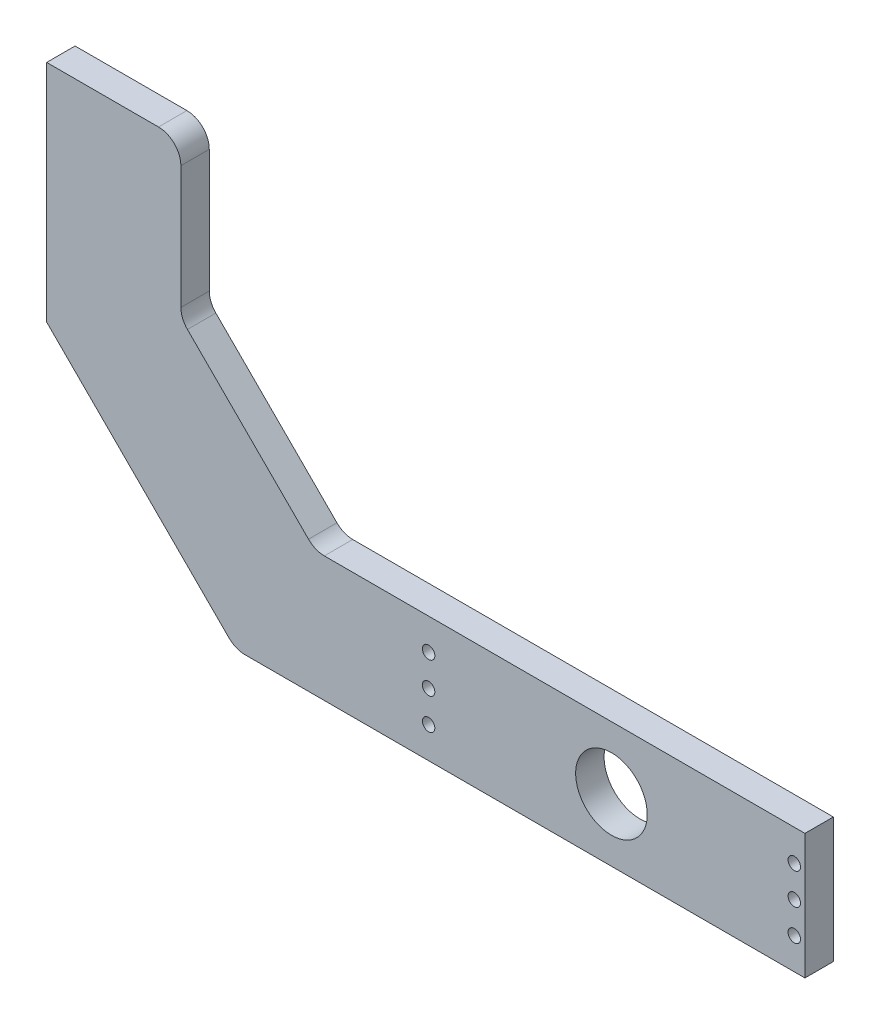
ISO-10303-21;
HEADER;
FILE_DESCRIPTION(('STEP AP214'),'2;1');
FILE_NAME('part.step','',(''),(''),'','','');
FILE_SCHEMA(('AUTOMOTIVE_DESIGN { 1 0 10303 214 1 1 1 1 }'));
ENDSEC;
DATA;
#1=APPLICATION_CONTEXT('core data for automotive mechanical design processes');
#2=APPLICATION_PROTOCOL_DEFINITION('international standard','automotive_design',2000,#1);
#3=PRODUCT_CONTEXT('',#1,'mechanical');
#4=PRODUCT('Part','Part','',(#3));
#5=PRODUCT_RELATED_PRODUCT_CATEGORY('part','',(#4));
#6=PRODUCT_DEFINITION_FORMATION('','',#4);
#7=PRODUCT_DEFINITION_CONTEXT('part definition',#1,'design');
#8=PRODUCT_DEFINITION('design','',#6,#7);
#9=PRODUCT_DEFINITION_SHAPE('','',#8);
#10=(LENGTH_UNIT() NAMED_UNIT(*) SI_UNIT(.MILLI.,.METRE.));
#11=(NAMED_UNIT(*) PLANE_ANGLE_UNIT() SI_UNIT($,.RADIAN.));
#12=(NAMED_UNIT(*) SI_UNIT($,.STERADIAN.) SOLID_ANGLE_UNIT());
#13=UNCERTAINTY_MEASURE_WITH_UNIT(LENGTH_MEASURE(1.E-05),#10,'distance_accuracy_value','');
#14=(GEOMETRIC_REPRESENTATION_CONTEXT(3) GLOBAL_UNCERTAINTY_ASSIGNED_CONTEXT((#13)) GLOBAL_UNIT_ASSIGNED_CONTEXT((#10,
#11,#12)) REPRESENTATION_CONTEXT('',''));
#15=CARTESIAN_POINT('',(0.,0.,0.));
#16=DIRECTION('',(0.,0.,1.));
#17=DIRECTION('',(1.,0.,0.));
#18=AXIS2_PLACEMENT_3D('',#15,#16,#17);
#19=CARTESIAN_POINT('',(18.4222454265078,-36.0239718131345,12.7));
#20=DIRECTION('',(0.,-1.,0.));
#21=DIRECTION('',(1.,0.,0.));
#22=AXIS2_PLACEMENT_3D('',#19,#20,#21);
#23=PLANE('',#22);
#24=DIRECTION('',(-1.,0.,0.));
#25=VECTOR('',#24,1.);
#26=CARTESIAN_POINT('',(18.4222454265078,-36.0239718131345,0.));
#27=LINE('',#26,#25);
#28=CARTESIAN_POINT('',(224.714042280299,-36.0239718131342,0.));
#29=VERTEX_POINT('',#28);
#30=CARTESIAN_POINT('',(9.85617790402953,-36.0239718131345,0.));
#31=VERTEX_POINT('',#30);
#32=EDGE_CURVE('E163',#29,#31,#27,.T.);
#33=ORIENTED_EDGE('',*,*,#32,.T.);
#34=DIRECTION('',(0.,0.,-1.));
#35=VECTOR('',#34,1.);
#36=CARTESIAN_POINT('',(9.85617790402953,-36.0239718131345,12.7));
#37=LINE('',#36,#35);
#38=CARTESIAN_POINT('',(9.85617790402953,-36.0239718131345,12.7));
#39=VERTEX_POINT('',#38);
#40=EDGE_CURVE('E198',#31,#39,#37,.F.);
#41=ORIENTED_EDGE('',*,*,#40,.T.);
#42=DIRECTION('',(-1.,0.,0.));
#43=VECTOR('',#42,1.);
#44=CARTESIAN_POINT('',(18.4222454265078,-36.0239718131345,12.7));
#45=LINE('',#44,#43);
#46=CARTESIAN_POINT('',(224.714042280299,-36.0239718131342,12.7));
#47=VERTEX_POINT('',#46);
#48=EDGE_CURVE('E180',#47,#39,#45,.T.);
#49=ORIENTED_EDGE('',*,*,#48,.F.);
#50=DIRECTION('',(0.,0.,-1.));
#51=VECTOR('',#50,1.);
#52=CARTESIAN_POINT('',(224.714042280299,-36.0239718131342,12.7));
#53=LINE('',#52,#51);
#54=EDGE_CURVE('E162',#47,#29,#53,.T.);
#55=ORIENTED_EDGE('',*,*,#54,.T.);
#56=EDGE_LOOP('',(#33,#41,#49,#55));
#57=FACE_BOUND('',#56,.T.);
#58=ADVANCED_FACE('F36',(#57),#23,.F.);
#59=CARTESIAN_POINT('',(201.815385528004,-232.125315060842,12.7));
#60=DIRECTION('',(-0.707106781186551,-0.707106781186544,0.));
#61=DIRECTION('',(0.707106781186544,-0.707106781186551,0.));
#62=AXIS2_PLACEMENT_3D('',#59,#60,#61);
#63=PLANE('',#62);
#64=DIRECTION('',(-0.707106781186544,0.707106781186551,0.));
#65=VECTOR('',#64,1.);
#66=CARTESIAN_POINT('',(201.815385528004,-232.125315060842,0.));
#67=LINE('',#66,#65);
#68=CARTESIAN_POINT('',(2.78511009216395,-33.0950396249999,0.));
#69=VERTEX_POINT('',#68);
#70=CARTESIAN_POINT('',(-51.3570255315668,21.0470959987314,0.));
#71=VERTEX_POINT('',#70);
#72=EDGE_CURVE('E166',#69,#71,#67,.T.);
#73=ORIENTED_EDGE('',*,*,#72,.T.);
#74=DIRECTION('',(0.,0.,-1.));
#75=VECTOR('',#74,1.);
#76=CARTESIAN_POINT('',(-51.3570255315668,21.0470959987314,12.7));
#77=LINE('',#76,#75);
#78=CARTESIAN_POINT('',(-51.3570255315668,21.0470959987314,12.7));
#79=VERTEX_POINT('',#78);
#80=EDGE_CURVE('E196',#71,#79,#77,.F.);
#81=ORIENTED_EDGE('',*,*,#80,.T.);
#82=DIRECTION('',(-0.707106781186544,0.707106781186551,0.));
#83=VECTOR('',#82,1.);
#84=CARTESIAN_POINT('',(201.815385528004,-232.125315060842,12.7));
#85=LINE('',#84,#83);
#86=CARTESIAN_POINT('',(2.78511009216395,-33.0950396249999,12.7));
#87=VERTEX_POINT('',#86);
#88=EDGE_CURVE('E230',#87,#79,#85,.T.);
#89=ORIENTED_EDGE('',*,*,#88,.F.);
#90=DIRECTION('',(0.,0.,-1.));
#91=VECTOR('',#90,1.);
#92=CARTESIAN_POINT('',(2.78511009216401,-33.0950396249999,0.));
#93=LINE('',#92,#91);
#94=EDGE_CURVE('E193',#87,#69,#93,.T.);
#95=ORIENTED_EDGE('',*,*,#94,.T.);
#96=EDGE_LOOP('',(#73,#81,#89,#95));
#97=FACE_BOUND('',#96,.T.);
#98=ADVANCED_FACE('F233',(#97),#63,.F.);
#99=CARTESIAN_POINT('',(-54.2859577197013,-415.518455162336,12.7));
#100=DIRECTION('',(1.,0.,0.));
#101=DIRECTION('',(0.,1.,0.));
#102=AXIS2_PLACEMENT_3D('',#99,#100,#101);
#103=PLANE('',#102);
#104=DIRECTION('',(0.,-1.,0.));
#105=VECTOR('',#104,1.);
#106=CARTESIAN_POINT('',(-54.2859577197013,-415.518455162336,12.7));
#107=LINE('',#106,#105);
#108=CARTESIAN_POINT('',(-54.2859577197012,82.9760281868659,12.7));
#109=VERTEX_POINT('',#108);
#110=CARTESIAN_POINT('',(-54.2859577197012,28.1181638105968,12.7));
#111=VERTEX_POINT('',#110);
#112=EDGE_CURVE('E157',#109,#111,#107,.T.);
#113=ORIENTED_EDGE('',*,*,#112,.T.);
#114=DIRECTION('',(0.,0.,-1.));
#115=VECTOR('',#114,1.);
#116=CARTESIAN_POINT('',(-54.2859577197012,28.1181638105968,12.7));
#117=LINE('',#116,#115);
#118=CARTESIAN_POINT('',(-54.2859577197012,28.1181638105968,0.));
#119=VERTEX_POINT('',#118);
#120=EDGE_CURVE('E190',#111,#119,#117,.T.);
#121=ORIENTED_EDGE('',*,*,#120,.T.);
#122=DIRECTION('',(0.,-1.,0.));
#123=VECTOR('',#122,1.);
#124=CARTESIAN_POINT('',(-54.2859577197013,-415.518455162336,0.));
#125=LINE('',#124,#123);
#126=CARTESIAN_POINT('',(-54.2859577197012,82.9760281868659,0.));
#127=VERTEX_POINT('',#126);
#128=EDGE_CURVE('E170',#127,#119,#125,.T.);
#129=ORIENTED_EDGE('',*,*,#128,.F.);
#130=DIRECTION('',(0.,0.,-1.));
#131=VECTOR('',#130,1.);
#132=CARTESIAN_POINT('',(-54.2859577197012,82.9760281868659,12.7));
#133=LINE('',#132,#131);
#134=EDGE_CURVE('E188',#127,#109,#133,.F.);
#135=ORIENTED_EDGE('',*,*,#134,.T.);
#136=EDGE_LOOP('',(#113,#121,#129,#135));
#137=FACE_BOUND('',#136,.T.);
#138=ADVANCED_FACE('F345',(#137),#103,.T.);
#139=CARTESIAN_POINT('',(18.4222454265079,92.976028186866,12.7));
#140=DIRECTION('',(0.,-1.,0.));
#141=DIRECTION('',(1.,0.,0.));
#142=AXIS2_PLACEMENT_3D('',#139,#140,#141);
#143=PLANE('',#142);
#144=DIRECTION('',(-1.,0.,0.));
#145=VECTOR('',#144,1.);
#146=CARTESIAN_POINT('',(18.4222454265079,92.976028186866,12.7));
#147=LINE('',#146,#145);
#148=CARTESIAN_POINT('',(-64.2859577197012,92.9760281868659,12.7));
#149=VERTEX_POINT('',#148);
#150=CARTESIAN_POINT('',(-114.285957719701,92.9760281868659,12.7));
#151=VERTEX_POINT('',#150);
#152=EDGE_CURVE('E151',#149,#151,#147,.T.);
#153=ORIENTED_EDGE('',*,*,#152,.F.);
#154=DIRECTION('',(0.,0.,-1.));
#155=VECTOR('',#154,1.);
#156=CARTESIAN_POINT('',(-64.2859577197012,92.9760281868659,0.));
#157=LINE('',#156,#155);
#158=CARTESIAN_POINT('',(-64.2859577197012,92.9760281868659,0.));
#159=VERTEX_POINT('',#158);
#160=EDGE_CURVE('E209',#149,#159,#157,.T.);
#161=ORIENTED_EDGE('',*,*,#160,.T.);
#162=DIRECTION('',(-1.,0.,0.));
#163=VECTOR('',#162,1.);
#164=CARTESIAN_POINT('',(18.4222454265079,92.976028186866,0.));
#165=LINE('',#164,#163);
#166=CARTESIAN_POINT('',(-114.285957719701,92.9760281868659,0.));
#167=VERTEX_POINT('',#166);
#168=EDGE_CURVE('E173',#159,#167,#165,.T.);
#169=ORIENTED_EDGE('',*,*,#168,.T.);
#170=DIRECTION('',(0.,0.,-1.));
#171=VECTOR('',#170,1.);
#172=CARTESIAN_POINT('',(-114.285957719701,92.9760281868659,12.7));
#173=LINE('',#172,#171);
#174=EDGE_CURVE('E186',#151,#167,#173,.T.);
#175=ORIENTED_EDGE('',*,*,#174,.F.);
#176=EDGE_LOOP('',(#153,#161,#169,#175));
#177=FACE_BOUND('',#176,.T.);
#178=ADVANCED_FACE('F374',(#177),#143,.F.);
#179=CARTESIAN_POINT('',(-114.285957719701,-415.518455162336,12.7));
#180=DIRECTION('',(1.,0.,0.));
#181=DIRECTION('',(0.,1.,0.));
#182=AXIS2_PLACEMENT_3D('',#179,#180,#181);
#183=PLANE('',#182);
#184=CARTESIAN_POINT('',(-114.285957719701,17.976028186866,7.90000000000001));
#185=DIRECTION('',(-1.,0.,0.));
#186=DIRECTION('',(0.,-1.,0.));
#187=AXIS2_PLACEMENT_3D('',#184,#185,#186);
#188=CIRCLE('',#187,2.5);
#189=CARTESIAN_POINT('',(-114.285957719701,15.476028186866,7.90000000000001));
#190=VERTEX_POINT('',#189);
#191=EDGE_CURVE('E257',#190,#190,#188,.T.);
#192=ORIENTED_EDGE('',*,*,#191,.F.);
#193=EDGE_LOOP('',(#192));
#194=FACE_BOUND('',#193,.T.);
#195=CARTESIAN_POINT('',(-114.285957719701,42.976028186866,7.90000000000001));
#196=DIRECTION('',(-1.,0.,0.));
#197=DIRECTION('',(0.,-1.,0.));
#198=AXIS2_PLACEMENT_3D('',#195,#196,#197);
#199=CIRCLE('',#198,2.5);
#200=CARTESIAN_POINT('',(-114.285957719701,40.476028186866,7.90000000000001));
#201=VERTEX_POINT('',#200);
#202=EDGE_CURVE('E251',#201,#201,#199,.T.);
#203=ORIENTED_EDGE('',*,*,#202,.F.);
#204=EDGE_LOOP('',(#203));
#205=FACE_BOUND('',#204,.T.);
#206=CARTESIAN_POINT('',(-114.285957719701,67.9760281868659,7.90000000000001));
#207=DIRECTION('',(-1.,0.,0.));
#208=DIRECTION('',(0.,-1.,0.));
#209=AXIS2_PLACEMENT_3D('',#206,#207,#208);
#210=CIRCLE('',#209,2.5);
#211=CARTESIAN_POINT('',(-114.285957719701,65.4760281868659,7.90000000000001));
#212=VERTEX_POINT('',#211);
#213=EDGE_CURVE('E245',#212,#212,#210,.T.);
#214=ORIENTED_EDGE('',*,*,#213,.F.);
#215=EDGE_LOOP('',(#214));
#216=FACE_BOUND('',#215,.T.);
#217=DIRECTION('',(0.,-1.,0.));
#218=VECTOR('',#217,1.);
#219=CARTESIAN_POINT('',(-114.285957719701,-415.518455162336,0.));
#220=LINE('',#219,#218);
#221=CARTESIAN_POINT('',(-114.285957719701,-7.57988285569777,0.));
#222=VERTEX_POINT('',#221);
#223=EDGE_CURVE('E145',#167,#222,#220,.T.);
#224=ORIENTED_EDGE('',*,*,#223,.T.);
#225=DIRECTION('',(0.,0.,1.));
#226=VECTOR('',#225,1.);
#227=CARTESIAN_POINT('',(-114.285957719701,-7.57988285569773,-0.000999999999999265));
#228=LINE('',#227,#226);
#229=CARTESIAN_POINT('',(-114.285957719701,-7.57988285569773,12.7));
#230=VERTEX_POINT('',#229);
#231=EDGE_CURVE('E130',#222,#230,#228,.T.);
#232=ORIENTED_EDGE('',*,*,#231,.T.);
#233=DIRECTION('',(0.,-1.,0.));
#234=VECTOR('',#233,1.);
#235=CARTESIAN_POINT('',(-114.285957719701,-415.518455162336,12.7));
#236=LINE('',#235,#234);
#237=EDGE_CURVE('E143',#151,#230,#236,.T.);
#238=ORIENTED_EDGE('',*,*,#237,.F.);
#239=ORIENTED_EDGE('',*,*,#174,.T.);
#240=EDGE_LOOP('',(#224,#232,#238,#239));
#241=FACE_BOUND('',#240,.T.);
#242=ADVANCED_FACE('F141',(#194,#205,#216,#241),#183,.F.);
#243=CARTESIAN_POINT('',(18.4222454265084,-92.0239718131342,12.7));
#244=DIRECTION('',(0.,1.,0.));
#245=DIRECTION('',(-1.,0.,0.));
#246=AXIS2_PLACEMENT_3D('',#243,#244,#245);
#247=PLANE('',#246);
#248=DIRECTION('',(1.,0.,0.));
#249=VECTOR('',#248,1.);
#250=CARTESIAN_POINT('',(18.4222454265084,-92.0239718131342,12.7));
#251=LINE('',#250,#249);
#252=CARTESIAN_POINT('',(-25.6997331385348,-92.0239718131342,12.7));
#253=VERTEX_POINT('',#252);
#254=CARTESIAN_POINT('',(224.714042280299,-92.0239718131341,12.7));
#255=VERTEX_POINT('',#254);
#256=EDGE_CURVE('E153',#253,#255,#251,.T.);
#257=ORIENTED_EDGE('',*,*,#256,.F.);
#258=DIRECTION('',(0.,0.,1.));
#259=VECTOR('',#258,1.);
#260=CARTESIAN_POINT('',(-25.6997331385348,-92.0239718131342,12.7));
#261=LINE('',#260,#259);
#262=CARTESIAN_POINT('',(-25.6997331385348,-92.0239718131342,0.));
#263=VERTEX_POINT('',#262);
#264=EDGE_CURVE('E59',#253,#263,#261,.F.);
#265=ORIENTED_EDGE('',*,*,#264,.T.);
#266=DIRECTION('',(1.,0.,0.));
#267=VECTOR('',#266,1.);
#268=CARTESIAN_POINT('',(18.4222454265084,-92.0239718131342,0.));
#269=LINE('',#268,#267);
#270=CARTESIAN_POINT('',(224.714042280299,-92.0239718131341,0.));
#271=VERTEX_POINT('',#270);
#272=EDGE_CURVE('E176',#263,#271,#269,.T.);
#273=ORIENTED_EDGE('',*,*,#272,.T.);
#274=DIRECTION('',(0.,0.,-1.));
#275=VECTOR('',#274,1.);
#276=CARTESIAN_POINT('',(224.714042280299,-92.0239718131341,12.7));
#277=LINE('',#276,#275);
#278=EDGE_CURVE('E183',#255,#271,#277,.T.);
#279=ORIENTED_EDGE('',*,*,#278,.F.);
#280=EDGE_LOOP('',(#257,#265,#273,#279));
#281=FACE_BOUND('',#280,.T.);
#282=ADVANCED_FACE('F362',(#281),#247,.F.);
#283=CARTESIAN_POINT('',(224.714042280299,-415.518455162336,12.7));
#284=DIRECTION('',(-1.,0.,0.));
#285=DIRECTION('',(0.,0.,1.));
#286=AXIS2_PLACEMENT_3D('',#283,#284,#285);
#287=PLANE('',#286);
#288=DIRECTION('',(0.,1.,0.));
#289=VECTOR('',#288,1.);
#290=CARTESIAN_POINT('',(224.714042280299,-415.518455162336,0.));
#291=LINE('',#290,#289);
#292=EDGE_CURVE('E178',#271,#29,#291,.T.);
#293=ORIENTED_EDGE('',*,*,#292,.T.);
#294=ORIENTED_EDGE('',*,*,#54,.F.);
#295=DIRECTION('',(0.,1.,0.));
#296=VECTOR('',#295,1.);
#297=CARTESIAN_POINT('',(224.714042280299,-415.518455162336,12.7));
#298=LINE('',#297,#296);
#299=EDGE_CURVE('E155',#255,#47,#298,.T.);
#300=ORIENTED_EDGE('',*,*,#299,.F.);
#301=ORIENTED_EDGE('',*,*,#278,.T.);
#302=EDGE_LOOP('',(#293,#294,#300,#301));
#303=FACE_BOUND('',#302,.T.);
#304=ADVANCED_FACE('F304',(#303),#287,.F.);
#305=CARTESIAN_POINT('',(18.4222454265084,-415.518455162336,12.7));
#306=DIRECTION('',(0.,0.,1.));
#307=DIRECTION('',(1.,0.,0.));
#308=AXIS2_PLACEMENT_3D('',#305,#306,#307);
#309=PLANE('',#308);
#310=CARTESIAN_POINT('',(219.954042280299,-50.0239718131341,12.7));
#311=DIRECTION('',(0.,0.,1.));
#312=DIRECTION('',(1.,0.,0.));
#313=AXIS2_PLACEMENT_3D('',#310,#311,#312);
#314=CIRCLE('',#313,2.78000000000001);
#315=CARTESIAN_POINT('',(222.734042280299,-50.0239718131341,12.7));
#316=VERTEX_POINT('',#315);
#317=EDGE_CURVE('E295',#316,#316,#314,.T.);
#318=ORIENTED_EDGE('',*,*,#317,.F.);
#319=EDGE_LOOP('',(#318));
#320=FACE_BOUND('',#319,.T.);
#321=CARTESIAN_POINT('',(219.954042280299,-64.0239718131341,12.7));
#322=DIRECTION('',(0.,0.,1.));
#323=DIRECTION('',(1.,0.,0.));
#324=AXIS2_PLACEMENT_3D('',#321,#322,#323);
#325=CIRCLE('',#324,2.78000000000001);
#326=CARTESIAN_POINT('',(222.734042280299,-64.0239718131341,12.7));
#327=VERTEX_POINT('',#326);
#328=EDGE_CURVE('E289',#327,#327,#325,.T.);
#329=ORIENTED_EDGE('',*,*,#328,.F.);
#330=EDGE_LOOP('',(#329));
#331=FACE_BOUND('',#330,.T.);
#332=CARTESIAN_POINT('',(219.954042280299,-78.0239718131342,12.7));
#333=DIRECTION('',(0.,0.,1.));
#334=DIRECTION('',(1.,0.,0.));
#335=AXIS2_PLACEMENT_3D('',#332,#333,#334);
#336=CIRCLE('',#335,2.78000000000001);
#337=CARTESIAN_POINT('',(222.734042280299,-78.0239718131342,12.7));
#338=VERTEX_POINT('',#337);
#339=EDGE_CURVE('E283',#338,#338,#336,.T.);
#340=ORIENTED_EDGE('',*,*,#339,.F.);
#341=EDGE_LOOP('',(#340));
#342=FACE_BOUND('',#341,.T.);
#343=CARTESIAN_POINT('',(56.4740422802987,-78.0239718131351,12.7));
#344=DIRECTION('',(0.,0.,1.));
#345=DIRECTION('',(1.,0.,0.));
#346=AXIS2_PLACEMENT_3D('',#343,#344,#345);
#347=CIRCLE('',#346,2.78000000000004);
#348=CARTESIAN_POINT('',(59.2540422802988,-78.0239718131351,12.7));
#349=VERTEX_POINT('',#348);
#350=EDGE_CURVE('E277',#349,#349,#347,.T.);
#351=ORIENTED_EDGE('',*,*,#350,.F.);
#352=EDGE_LOOP('',(#351));
#353=FACE_BOUND('',#352,.T.);
#354=CARTESIAN_POINT('',(56.4740422802987,-64.0239718131351,12.7));
#355=DIRECTION('',(0.,0.,1.));
#356=DIRECTION('',(1.,0.,0.));
#357=AXIS2_PLACEMENT_3D('',#354,#355,#356);
#358=CIRCLE('',#357,2.78000000000004);
#359=CARTESIAN_POINT('',(59.2540422802988,-64.0239718131351,12.7));
#360=VERTEX_POINT('',#359);
#361=EDGE_CURVE('E271',#360,#360,#358,.T.);
#362=ORIENTED_EDGE('',*,*,#361,.F.);
#363=EDGE_LOOP('',(#362));
#364=FACE_BOUND('',#363,.T.);
#365=CARTESIAN_POINT('',(56.4740422802987,-50.0239718131351,12.7));
#366=DIRECTION('',(0.,0.,1.));
#367=DIRECTION('',(1.,0.,0.));
#368=AXIS2_PLACEMENT_3D('',#365,#366,#367);
#369=CIRCLE('',#368,2.78);
#370=CARTESIAN_POINT('',(59.2540422802987,-50.0239718131351,12.7));
#371=VERTEX_POINT('',#370);
#372=EDGE_CURVE('E265',#371,#371,#369,.T.);
#373=ORIENTED_EDGE('',*,*,#372,.F.);
#374=EDGE_LOOP('',(#373));
#375=FACE_BOUND('',#374,.T.);
#376=DIRECTION('',(-0.707106781186544,0.707106781186551,0.));
#377=VECTOR('',#376,1.);
#378=CARTESIAN_POINT('',(-29.8418687622658,-92.0239718131342,12.7));
#379=LINE('',#378,#377);
#380=CARTESIAN_POINT('',(-32.7708009504003,-89.0950396249996,12.7));
#381=VERTEX_POINT('',#380);
#382=EDGE_CURVE('E126',#381,#230,#379,.T.);
#383=ORIENTED_EDGE('',*,*,#382,.F.);
#384=CARTESIAN_POINT('',(-25.6997331385348,-82.0239718131342,12.7));
#385=DIRECTION('',(0.,0.,1.));
#386=DIRECTION('',(1.,0.,0.));
#387=AXIS2_PLACEMENT_3D('',#384,#385,#386);
#388=CIRCLE('',#387,10.);
#389=EDGE_CURVE('E203',#381,#253,#388,.T.);
#390=ORIENTED_EDGE('',*,*,#389,.T.);
#391=ORIENTED_EDGE('',*,*,#256,.T.);
#392=ORIENTED_EDGE('',*,*,#299,.T.);
#393=ORIENTED_EDGE('',*,*,#48,.T.);
#394=CARTESIAN_POINT('',(9.85617790402951,-26.0239718131345,12.7));
#395=DIRECTION('',(0.,0.,1.));
#396=DIRECTION('',(1.,0.,0.));
#397=AXIS2_PLACEMENT_3D('',#394,#395,#396);
#398=CIRCLE('',#397,10.);
#399=EDGE_CURVE('E11',#39,#87,#398,.F.);
#400=ORIENTED_EDGE('',*,*,#399,.T.);
#401=ORIENTED_EDGE('',*,*,#88,.T.);
#402=CARTESIAN_POINT('',(-44.2859577197012,28.1181638105968,12.7));
#403=DIRECTION('',(0.,0.,1.));
#404=DIRECTION('',(1.,0.,0.));
#405=AXIS2_PLACEMENT_3D('',#402,#403,#404);
#406=CIRCLE('',#405,10.);
#407=EDGE_CURVE('E213',#79,#111,#406,.F.);
#408=ORIENTED_EDGE('',*,*,#407,.T.);
#409=ORIENTED_EDGE('',*,*,#112,.F.);
#410=CARTESIAN_POINT('',(-64.2859577197012,82.9760281868659,12.7));
#411=DIRECTION('',(0.,0.,1.));
#412=DIRECTION('',(1.,0.,0.));
#413=AXIS2_PLACEMENT_3D('',#410,#411,#412);
#414=CIRCLE('',#413,10.);
#415=EDGE_CURVE('E201',#109,#149,#414,.T.);
#416=ORIENTED_EDGE('',*,*,#415,.T.);
#417=ORIENTED_EDGE('',*,*,#152,.T.);
#418=ORIENTED_EDGE('',*,*,#237,.T.);
#419=EDGE_LOOP('',(#383,#390,#391,#392,#393,#400,#401,#408,#409,#416,#417,#418));
#420=FACE_BOUND('',#419,.T.);
#421=CARTESIAN_POINT('',(138.214042280299,-64.0239718131342,12.7));
#422=DIRECTION('',(0.,0.,1.));
#423=DIRECTION('',(1.,0.,0.));
#424=AXIS2_PLACEMENT_3D('',#421,#422,#423);
#425=CIRCLE('',#424,16.);
#426=CARTESIAN_POINT('',(154.214042280299,-64.0239718131342,12.7));
#427=VERTEX_POINT('',#426);
#428=EDGE_CURVE('E241',#427,#427,#425,.T.);
#429=ORIENTED_EDGE('',*,*,#428,.F.);
#430=EDGE_LOOP('',(#429));
#431=FACE_BOUND('',#430,.T.);
#432=ADVANCED_FACE('F148',(#320,#331,#342,#353,#364,#375,#420,#431),#309,.T.);
#433=CARTESIAN_POINT('',(18.4222454265084,-415.518455162336,0.));
#434=DIRECTION('',(0.,0.,1.));
#435=DIRECTION('',(1.,0.,0.));
#436=AXIS2_PLACEMENT_3D('',#433,#434,#435);
#437=PLANE('',#436);
#438=CARTESIAN_POINT('',(219.954042280299,-50.0239718131341,0.));
#439=DIRECTION('',(0.,0.,1.));
#440=DIRECTION('',(1.,0.,0.));
#441=AXIS2_PLACEMENT_3D('',#438,#439,#440);
#442=CIRCLE('',#441,2.78000000000001);
#443=CARTESIAN_POINT('',(222.734042280299,-50.0239718131341,0.));
#444=VERTEX_POINT('',#443);
#445=EDGE_CURVE('E292',#444,#444,#442,.F.);
#446=ORIENTED_EDGE('',*,*,#445,.F.);
#447=EDGE_LOOP('',(#446));
#448=FACE_BOUND('',#447,.T.);
#449=CARTESIAN_POINT('',(219.954042280299,-64.0239718131341,0.));
#450=DIRECTION('',(0.,0.,1.));
#451=DIRECTION('',(1.,0.,0.));
#452=AXIS2_PLACEMENT_3D('',#449,#450,#451);
#453=CIRCLE('',#452,2.78000000000001);
#454=CARTESIAN_POINT('',(222.734042280299,-64.0239718131341,0.));
#455=VERTEX_POINT('',#454);
#456=EDGE_CURVE('E286',#455,#455,#453,.F.);
#457=ORIENTED_EDGE('',*,*,#456,.F.);
#458=EDGE_LOOP('',(#457));
#459=FACE_BOUND('',#458,.T.);
#460=CARTESIAN_POINT('',(219.954042280299,-78.0239718131342,0.));
#461=DIRECTION('',(0.,0.,1.));
#462=DIRECTION('',(1.,0.,0.));
#463=AXIS2_PLACEMENT_3D('',#460,#461,#462);
#464=CIRCLE('',#463,2.78000000000001);
#465=CARTESIAN_POINT('',(222.734042280299,-78.0239718131342,0.));
#466=VERTEX_POINT('',#465);
#467=EDGE_CURVE('E280',#466,#466,#464,.F.);
#468=ORIENTED_EDGE('',*,*,#467,.F.);
#469=EDGE_LOOP('',(#468));
#470=FACE_BOUND('',#469,.T.);
#471=CARTESIAN_POINT('',(56.4740422802987,-78.0239718131351,0.));
#472=DIRECTION('',(0.,0.,1.));
#473=DIRECTION('',(1.,0.,0.));
#474=AXIS2_PLACEMENT_3D('',#471,#472,#473);
#475=CIRCLE('',#474,2.78000000000004);
#476=CARTESIAN_POINT('',(59.2540422802988,-78.0239718131351,0.));
#477=VERTEX_POINT('',#476);
#478=EDGE_CURVE('E274',#477,#477,#475,.F.);
#479=ORIENTED_EDGE('',*,*,#478,.F.);
#480=EDGE_LOOP('',(#479));
#481=FACE_BOUND('',#480,.T.);
#482=CARTESIAN_POINT('',(56.4740422802987,-64.0239718131351,0.));
#483=DIRECTION('',(0.,0.,1.));
#484=DIRECTION('',(1.,0.,0.));
#485=AXIS2_PLACEMENT_3D('',#482,#483,#484);
#486=CIRCLE('',#485,2.78000000000004);
#487=CARTESIAN_POINT('',(59.2540422802988,-64.0239718131351,0.));
#488=VERTEX_POINT('',#487);
#489=EDGE_CURVE('E268',#488,#488,#486,.F.);
#490=ORIENTED_EDGE('',*,*,#489,.F.);
#491=EDGE_LOOP('',(#490));
#492=FACE_BOUND('',#491,.T.);
#493=CARTESIAN_POINT('',(56.4740422802987,-50.0239718131351,0.));
#494=DIRECTION('',(0.,0.,1.));
#495=DIRECTION('',(1.,0.,0.));
#496=AXIS2_PLACEMENT_3D('',#493,#494,#495);
#497=CIRCLE('',#496,2.78);
#498=CARTESIAN_POINT('',(59.2540422802987,-50.0239718131351,0.));
#499=VERTEX_POINT('',#498);
#500=EDGE_CURVE('E136',#499,#499,#497,.F.);
#501=ORIENTED_EDGE('',*,*,#500,.F.);
#502=EDGE_LOOP('',(#501));
#503=FACE_BOUND('',#502,.T.);
#504=CARTESIAN_POINT('',(138.214042280299,-64.0239718131342,0.));
#505=DIRECTION('',(0.,0.,1.));
#506=DIRECTION('',(1.,0.,0.));
#507=AXIS2_PLACEMENT_3D('',#504,#505,#506);
#508=CIRCLE('',#507,16.);
#509=CARTESIAN_POINT('',(154.214042280299,-64.0239718131342,0.));
#510=VERTEX_POINT('',#509);
#511=EDGE_CURVE('E167',#510,#510,#508,.F.);
#512=ORIENTED_EDGE('',*,*,#511,.F.);
#513=EDGE_LOOP('',(#512));
#514=FACE_BOUND('',#513,.T.);
#515=ORIENTED_EDGE('',*,*,#272,.F.);
#516=CARTESIAN_POINT('',(-25.6997331385348,-82.0239718131342,0.));
#517=DIRECTION('',(0.,0.,1.));
#518=DIRECTION('',(1.,0.,0.));
#519=AXIS2_PLACEMENT_3D('',#516,#517,#518);
#520=CIRCLE('',#519,10.);
#521=CARTESIAN_POINT('',(-32.7708009504003,-89.0950396249996,0.));
#522=VERTEX_POINT('',#521);
#523=EDGE_CURVE('E207',#263,#522,#520,.F.);
#524=ORIENTED_EDGE('',*,*,#523,.T.);
#525=DIRECTION('',(0.707106781186544,-0.707106781186551,0.));
#526=VECTOR('',#525,1.);
#527=CARTESIAN_POINT('',(-29.8418687622658,-92.0239718131342,0.));
#528=LINE('',#527,#526);
#529=EDGE_CURVE('E146',#222,#522,#528,.T.);
#530=ORIENTED_EDGE('',*,*,#529,.F.);
#531=ORIENTED_EDGE('',*,*,#223,.F.);
#532=ORIENTED_EDGE('',*,*,#168,.F.);
#533=CARTESIAN_POINT('',(-64.2859577197012,82.9760281868659,0.));
#534=DIRECTION('',(0.,0.,1.));
#535=DIRECTION('',(1.,0.,0.));
#536=AXIS2_PLACEMENT_3D('',#533,#534,#535);
#537=CIRCLE('',#536,10.);
#538=EDGE_CURVE('E51',#159,#127,#537,.F.);
#539=ORIENTED_EDGE('',*,*,#538,.T.);
#540=ORIENTED_EDGE('',*,*,#128,.T.);
#541=CARTESIAN_POINT('',(-44.2859577197012,28.1181638105968,0.));
#542=DIRECTION('',(0.,0.,1.));
#543=DIRECTION('',(1.,0.,0.));
#544=AXIS2_PLACEMENT_3D('',#541,#542,#543);
#545=CIRCLE('',#544,10.);
#546=EDGE_CURVE('E211',#119,#71,#545,.T.);
#547=ORIENTED_EDGE('',*,*,#546,.T.);
#548=ORIENTED_EDGE('',*,*,#72,.F.);
#549=CARTESIAN_POINT('',(9.85617790402951,-26.0239718131345,0.));
#550=DIRECTION('',(0.,0.,1.));
#551=DIRECTION('',(1.,0.,0.));
#552=AXIS2_PLACEMENT_3D('',#549,#550,#551);
#553=CIRCLE('',#552,10.);
#554=EDGE_CURVE('E44',#69,#31,#553,.T.);
#555=ORIENTED_EDGE('',*,*,#554,.T.);
#556=ORIENTED_EDGE('',*,*,#32,.F.);
#557=ORIENTED_EDGE('',*,*,#292,.F.);
#558=EDGE_LOOP('',(#515,#524,#530,#531,#532,#539,#540,#547,#548,#555,#556,#557));
#559=FACE_BOUND('',#558,.T.);
#560=ADVANCED_FACE('F217',(#448,#459,#470,#481,#492,#503,#514,#559),#437,.F.);
#561=CARTESIAN_POINT('',(138.214042280299,-64.0239718131342,-0.000999999999999265));
#562=DIRECTION('',(0.,0.,1.));
#563=DIRECTION('',(1.,0.,0.));
#564=AXIS2_PLACEMENT_3D('',#561,#562,#563);
#565=CYLINDRICAL_SURFACE('',#564,16.);
#566=ORIENTED_EDGE('',*,*,#428,.T.);
#567=EDGE_LOOP('',(#566));
#568=FACE_BOUND('',#567,.T.);
#569=ORIENTED_EDGE('',*,*,#511,.T.);
#570=EDGE_LOOP('',(#569));
#571=FACE_BOUND('',#570,.T.);
#572=ADVANCED_FACE('F325',(#568,#571),#565,.F.);
#573=CARTESIAN_POINT('',(-84.2859577197013,67.9760281868659,7.90000000000001));
#574=DIRECTION('',(-1.,0.,0.));
#575=DIRECTION('',(0.,-1.,0.));
#576=AXIS2_PLACEMENT_3D('',#573,#574,#575);
#577=CYLINDRICAL_SURFACE('',#576,2.5);
#578=CARTESIAN_POINT('',(-84.2859577197013,67.9760281868659,7.90000000000001));
#579=DIRECTION('',(-1.,0.,0.));
#580=DIRECTION('',(0.,-1.,0.));
#581=AXIS2_PLACEMENT_3D('',#578,#579,#580);
#582=CIRCLE('',#581,2.5);
#583=CARTESIAN_POINT('',(-84.2859577197013,65.4760281868659,7.90000000000001));
#584=VERTEX_POINT('',#583);
#585=EDGE_CURVE('E244',#584,#584,#582,.T.);
#586=ORIENTED_EDGE('',*,*,#585,.F.);
#587=EDGE_LOOP('',(#586));
#588=FACE_BOUND('',#587,.T.);
#589=ORIENTED_EDGE('',*,*,#213,.T.);
#590=EDGE_LOOP('',(#589));
#591=FACE_BOUND('',#590,.T.);
#592=ADVANCED_FACE('F331',(#588,#591),#577,.F.);
#593=CARTESIAN_POINT('',(-84.2859577197013,67.9760281868659,7.90000000000001));
#594=DIRECTION('',(-1.,0.,0.));
#595=DIRECTION('',(0.,-1.,0.));
#596=AXIS2_PLACEMENT_3D('',#593,#594,#595);
#597=PLANE('',#596);
#598=ORIENTED_EDGE('',*,*,#585,.T.);
#599=EDGE_LOOP('',(#598));
#600=FACE_BOUND('',#599,.T.);
#601=ADVANCED_FACE('F337',(#600),#597,.T.);
#602=CARTESIAN_POINT('',(-84.2859577197013,42.976028186866,7.90000000000001));
#603=DIRECTION('',(-1.,0.,0.));
#604=DIRECTION('',(0.,-1.,0.));
#605=AXIS2_PLACEMENT_3D('',#602,#603,#604);
#606=CYLINDRICAL_SURFACE('',#605,2.5);
#607=CARTESIAN_POINT('',(-84.2859577197013,42.976028186866,7.90000000000001));
#608=DIRECTION('',(-1.,0.,0.));
#609=DIRECTION('',(0.,-1.,0.));
#610=AXIS2_PLACEMENT_3D('',#607,#608,#609);
#611=CIRCLE('',#610,2.5);
#612=CARTESIAN_POINT('',(-84.2859577197013,40.476028186866,7.90000000000001));
#613=VERTEX_POINT('',#612);
#614=EDGE_CURVE('E248',#613,#613,#611,.T.);
#615=ORIENTED_EDGE('',*,*,#614,.F.);
#616=EDGE_LOOP('',(#615));
#617=FACE_BOUND('',#616,.T.);
#618=ORIENTED_EDGE('',*,*,#202,.T.);
#619=EDGE_LOOP('',(#618));
#620=FACE_BOUND('',#619,.T.);
#621=ADVANCED_FACE('F515',(#617,#620),#606,.F.);
#622=CARTESIAN_POINT('',(-84.2859577197013,42.976028186866,7.90000000000001));
#623=DIRECTION('',(-1.,0.,0.));
#624=DIRECTION('',(0.,-1.,0.));
#625=AXIS2_PLACEMENT_3D('',#622,#623,#624);
#626=PLANE('',#625);
#627=ORIENTED_EDGE('',*,*,#614,.T.);
#628=EDGE_LOOP('',(#627));
#629=FACE_BOUND('',#628,.T.);
#630=ADVANCED_FACE('F525',(#629),#626,.T.);
#631=CARTESIAN_POINT('',(-84.2859577197013,17.976028186866,7.90000000000001));
#632=DIRECTION('',(-1.,0.,0.));
#633=DIRECTION('',(0.,-1.,0.));
#634=AXIS2_PLACEMENT_3D('',#631,#632,#633);
#635=CYLINDRICAL_SURFACE('',#634,2.5);
#636=CARTESIAN_POINT('',(-84.2859577197013,17.976028186866,7.90000000000001));
#637=DIRECTION('',(-1.,0.,0.));
#638=DIRECTION('',(0.,-1.,0.));
#639=AXIS2_PLACEMENT_3D('',#636,#637,#638);
#640=CIRCLE('',#639,2.5);
#641=CARTESIAN_POINT('',(-84.2859577197013,15.476028186866,7.90000000000001));
#642=VERTEX_POINT('',#641);
#643=EDGE_CURVE('E254',#642,#642,#640,.T.);
#644=ORIENTED_EDGE('',*,*,#643,.F.);
#645=EDGE_LOOP('',(#644));
#646=FACE_BOUND('',#645,.T.);
#647=ORIENTED_EDGE('',*,*,#191,.T.);
#648=EDGE_LOOP('',(#647));
#649=FACE_BOUND('',#648,.T.);
#650=ADVANCED_FACE('F535',(#646,#649),#635,.F.);
#651=CARTESIAN_POINT('',(-84.2859577197013,17.976028186866,7.90000000000001));
#652=DIRECTION('',(-1.,0.,0.));
#653=DIRECTION('',(0.,-1.,0.));
#654=AXIS2_PLACEMENT_3D('',#651,#652,#653);
#655=PLANE('',#654);
#656=ORIENTED_EDGE('',*,*,#643,.T.);
#657=EDGE_LOOP('',(#656));
#658=FACE_BOUND('',#657,.T.);
#659=ADVANCED_FACE('F419',(#658),#655,.T.);
#660=CARTESIAN_POINT('',(-29.8418687622658,-92.0239718131342,-0.000999999999999265));
#661=DIRECTION('',(0.707106781186551,0.707106781186544,0.));
#662=DIRECTION('',(-0.707106781186544,0.707106781186551,0.));
#663=AXIS2_PLACEMENT_3D('',#660,#661,#662);
#664=PLANE('',#663);
#665=ORIENTED_EDGE('',*,*,#529,.T.);
#666=DIRECTION('',(0.,0.,1.));
#667=VECTOR('',#666,1.);
#668=CARTESIAN_POINT('',(-32.7708009504003,-89.0950396249996,-0.000999999999999265));
#669=LINE('',#668,#667);
#670=EDGE_CURVE('E133',#522,#381,#669,.T.);
#671=ORIENTED_EDGE('',*,*,#670,.T.);
#672=ORIENTED_EDGE('',*,*,#382,.T.);
#673=ORIENTED_EDGE('',*,*,#231,.F.);
#674=EDGE_LOOP('',(#665,#671,#672,#673));
#675=FACE_BOUND('',#674,.T.);
#676=ADVANCED_FACE('F129',(#675),#664,.F.);
#677=CARTESIAN_POINT('',(56.4740422802987,-50.0239718131351,-0.000999999999999265));
#678=DIRECTION('',(0.,0.,1.));
#679=DIRECTION('',(1.,0.,0.));
#680=AXIS2_PLACEMENT_3D('',#677,#678,#679);
#681=CYLINDRICAL_SURFACE('',#680,2.78);
#682=ORIENTED_EDGE('',*,*,#372,.T.);
#683=EDGE_LOOP('',(#682));
#684=FACE_BOUND('',#683,.T.);
#685=ORIENTED_EDGE('',*,*,#500,.T.);
#686=EDGE_LOOP('',(#685));
#687=FACE_BOUND('',#686,.T.);
#688=ADVANCED_FACE('F316',(#684,#687),#681,.F.);
#689=CARTESIAN_POINT('',(56.4740422802987,-64.0239718131351,-0.000999999999999265));
#690=DIRECTION('',(0.,0.,1.));
#691=DIRECTION('',(1.,0.,0.));
#692=AXIS2_PLACEMENT_3D('',#689,#690,#691);
#693=CYLINDRICAL_SURFACE('',#692,2.78000000000004);
#694=ORIENTED_EDGE('',*,*,#361,.T.);
#695=EDGE_LOOP('',(#694));
#696=FACE_BOUND('',#695,.T.);
#697=ORIENTED_EDGE('',*,*,#489,.T.);
#698=EDGE_LOOP('',(#697));
#699=FACE_BOUND('',#698,.T.);
#700=ADVANCED_FACE('F319',(#696,#699),#693,.F.);
#701=CARTESIAN_POINT('',(56.4740422802987,-78.0239718131351,-0.000999999999999265));
#702=DIRECTION('',(0.,0.,1.));
#703=DIRECTION('',(1.,0.,0.));
#704=AXIS2_PLACEMENT_3D('',#701,#702,#703);
#705=CYLINDRICAL_SURFACE('',#704,2.78000000000004);
#706=ORIENTED_EDGE('',*,*,#350,.T.);
#707=EDGE_LOOP('',(#706));
#708=FACE_BOUND('',#707,.T.);
#709=ORIENTED_EDGE('',*,*,#478,.T.);
#710=EDGE_LOOP('',(#709));
#711=FACE_BOUND('',#710,.T.);
#712=ADVANCED_FACE('F438',(#708,#711),#705,.F.);
#713=CARTESIAN_POINT('',(219.954042280299,-78.0239718131342,-0.000999999999999265));
#714=DIRECTION('',(0.,0.,1.));
#715=DIRECTION('',(1.,0.,0.));
#716=AXIS2_PLACEMENT_3D('',#713,#714,#715);
#717=CYLINDRICAL_SURFACE('',#716,2.78000000000001);
#718=ORIENTED_EDGE('',*,*,#339,.T.);
#719=EDGE_LOOP('',(#718));
#720=FACE_BOUND('',#719,.T.);
#721=ORIENTED_EDGE('',*,*,#467,.T.);
#722=EDGE_LOOP('',(#721));
#723=FACE_BOUND('',#722,.T.);
#724=ADVANCED_FACE('F446',(#720,#723),#717,.F.);
#725=CARTESIAN_POINT('',(219.954042280299,-64.0239718131341,-0.000999999999999265));
#726=DIRECTION('',(0.,0.,1.));
#727=DIRECTION('',(1.,0.,0.));
#728=AXIS2_PLACEMENT_3D('',#725,#726,#727);
#729=CYLINDRICAL_SURFACE('',#728,2.78000000000001);
#730=ORIENTED_EDGE('',*,*,#328,.T.);
#731=EDGE_LOOP('',(#730));
#732=FACE_BOUND('',#731,.T.);
#733=ORIENTED_EDGE('',*,*,#456,.T.);
#734=EDGE_LOOP('',(#733));
#735=FACE_BOUND('',#734,.T.);
#736=ADVANCED_FACE('F454',(#732,#735),#729,.F.);
#737=CARTESIAN_POINT('',(219.954042280299,-50.0239718131341,-0.000999999999999265));
#738=DIRECTION('',(0.,0.,1.));
#739=DIRECTION('',(1.,0.,0.));
#740=AXIS2_PLACEMENT_3D('',#737,#738,#739);
#741=CYLINDRICAL_SURFACE('',#740,2.78000000000001);
#742=ORIENTED_EDGE('',*,*,#317,.T.);
#743=EDGE_LOOP('',(#742));
#744=FACE_BOUND('',#743,.T.);
#745=ORIENTED_EDGE('',*,*,#445,.T.);
#746=EDGE_LOOP('',(#745));
#747=FACE_BOUND('',#746,.T.);
#748=ADVANCED_FACE('F299',(#744,#747),#741,.F.);
#749=CARTESIAN_POINT('',(-44.2859577197012,28.1181638105968,12.7));
#750=DIRECTION('',(0.,0.,-1.));
#751=DIRECTION('',(-1.,0.,0.));
#752=AXIS2_PLACEMENT_3D('',#749,#750,#751);
#753=CYLINDRICAL_SURFACE('',#752,10.);
#754=ORIENTED_EDGE('',*,*,#407,.F.);
#755=ORIENTED_EDGE('',*,*,#80,.F.);
#756=ORIENTED_EDGE('',*,*,#546,.F.);
#757=ORIENTED_EDGE('',*,*,#120,.F.);
#758=EDGE_LOOP('',(#754,#755,#756,#757));
#759=FACE_BOUND('',#758,.T.);
#760=ADVANCED_FACE('F349',(#759),#753,.F.);
#761=CARTESIAN_POINT('',(9.85617790402951,-26.0239718131345,12.7));
#762=DIRECTION('',(0.,0.,1.));
#763=DIRECTION('',(1.,0.,0.));
#764=AXIS2_PLACEMENT_3D('',#761,#762,#763);
#765=CYLINDRICAL_SURFACE('',#764,10.);
#766=ORIENTED_EDGE('',*,*,#399,.F.);
#767=ORIENTED_EDGE('',*,*,#40,.F.);
#768=ORIENTED_EDGE('',*,*,#554,.F.);
#769=ORIENTED_EDGE('',*,*,#94,.F.);
#770=EDGE_LOOP('',(#766,#767,#768,#769));
#771=FACE_BOUND('',#770,.T.);
#772=ADVANCED_FACE('F227',(#771),#765,.F.);
#773=CARTESIAN_POINT('',(-25.6997331385348,-82.0239718131342,-0.000999999999999265));
#774=DIRECTION('',(0.,0.,1.));
#775=DIRECTION('',(1.,0.,0.));
#776=AXIS2_PLACEMENT_3D('',#773,#774,#775);
#777=CYLINDRICAL_SURFACE('',#776,10.);
#778=ORIENTED_EDGE('',*,*,#523,.F.);
#779=ORIENTED_EDGE('',*,*,#264,.F.);
#780=ORIENTED_EDGE('',*,*,#389,.F.);
#781=ORIENTED_EDGE('',*,*,#670,.F.);
#782=EDGE_LOOP('',(#778,#779,#780,#781));
#783=FACE_BOUND('',#782,.T.);
#784=ADVANCED_FACE('F354',(#783),#777,.T.);
#785=CARTESIAN_POINT('',(-64.2859577197012,82.9760281868659,12.7));
#786=DIRECTION('',(0.,0.,1.));
#787=DIRECTION('',(1.,0.,0.));
#788=AXIS2_PLACEMENT_3D('',#785,#786,#787);
#789=CYLINDRICAL_SURFACE('',#788,10.);
#790=ORIENTED_EDGE('',*,*,#415,.F.);
#791=ORIENTED_EDGE('',*,*,#134,.F.);
#792=ORIENTED_EDGE('',*,*,#538,.F.);
#793=ORIENTED_EDGE('',*,*,#160,.F.);
#794=EDGE_LOOP('',(#790,#791,#792,#793));
#795=FACE_BOUND('',#794,.T.);
#796=ADVANCED_FACE('F38',(#795),#789,.T.);
#797=CLOSED_SHELL('',(#58,#98,#138,#178,#242,#282,#304,#432,#560,#572,#592,#601,#621,#630,#650,
#659,#676,#688,#700,#712,#724,#736,#748,#760,#772,#784,#796));
#798=MANIFOLD_SOLID_BREP('B2',#797);
#799=ADVANCED_BREP_SHAPE_REPRESENTATION('',(#18,#798),#14);
#800=SHAPE_DEFINITION_REPRESENTATION(#9,#799);
ENDSEC;
END-ISO-10303-21;
